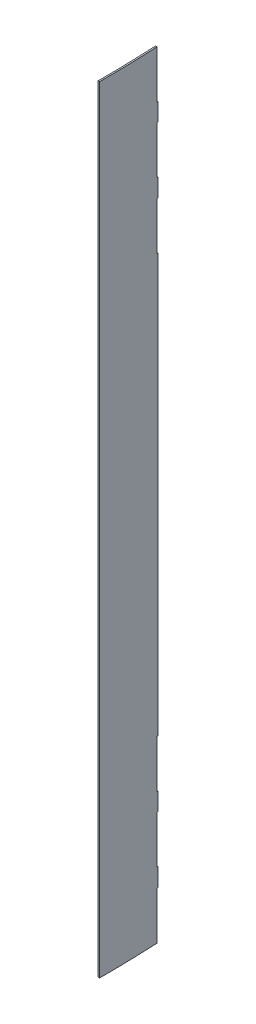
ISO-10303-21;
HEADER;
FILE_DESCRIPTION(('STEP AP214'),'2;1');
FILE_NAME('part.step','',(''),(''),'','','');
FILE_SCHEMA(('AUTOMOTIVE_DESIGN { 1 0 10303 214 1 1 1 1 }'));
ENDSEC;
DATA;
#1=APPLICATION_CONTEXT('core data for automotive mechanical design processes');
#2=APPLICATION_PROTOCOL_DEFINITION('international standard','automotive_design',2000,#1);
#3=PRODUCT_CONTEXT('',#1,'mechanical');
#4=PRODUCT('Part','Part','',(#3));
#5=PRODUCT_RELATED_PRODUCT_CATEGORY('part','',(#4));
#6=PRODUCT_DEFINITION_FORMATION('','',#4);
#7=PRODUCT_DEFINITION_CONTEXT('part definition',#1,'design');
#8=PRODUCT_DEFINITION('design','',#6,#7);
#9=PRODUCT_DEFINITION_SHAPE('','',#8);
#10=(LENGTH_UNIT() NAMED_UNIT(*) SI_UNIT(.MILLI.,.METRE.));
#11=(NAMED_UNIT(*) PLANE_ANGLE_UNIT() SI_UNIT($,.RADIAN.));
#12=(NAMED_UNIT(*) SI_UNIT($,.STERADIAN.) SOLID_ANGLE_UNIT());
#13=UNCERTAINTY_MEASURE_WITH_UNIT(LENGTH_MEASURE(1.E-05),#10,'distance_accuracy_value','');
#14=(GEOMETRIC_REPRESENTATION_CONTEXT(3) GLOBAL_UNCERTAINTY_ASSIGNED_CONTEXT((#13)) GLOBAL_UNIT_ASSIGNED_CONTEXT((#10,
#11,#12)) REPRESENTATION_CONTEXT('',''));
#15=CARTESIAN_POINT('',(0.,0.,0.));
#16=DIRECTION('',(0.,0.,1.));
#17=DIRECTION('',(1.,0.,0.));
#18=AXIS2_PLACEMENT_3D('',#15,#16,#17);
#19=CARTESIAN_POINT('',(0.,19.,0.));
#20=DIRECTION('',(0.,1.,0.));
#21=DIRECTION('',(0.,0.,1.));
#22=AXIS2_PLACEMENT_3D('',#19,#20,#21);
#23=PLANE('',#22);
#24=DIRECTION('',(-0.998690936139058,0.,0.0511508951406651));
#25=VECTOR('',#24,1.);
#26=CARTESIAN_POINT('',(195.244078015186,19.,-10.));
#27=LINE('',#26,#25);
#28=CARTESIAN_POINT('',(195.493750749221,19.,-10.0127877237851));
#29=VERTEX_POINT('',#28);
#30=CARTESIAN_POINT('',(195.244078015186,19.,-10.));
#31=VERTEX_POINT('',#30);
#32=EDGE_CURVE('E11',#29,#31,#27,.T.);
#33=ORIENTED_EDGE('',*,*,#32,.F.);
#34=CARTESIAN_POINT('',(0.,19.,0.));
#35=DIRECTION('',(0.,-1.,0.));
#36=DIRECTION('',(0.,0.,-1.));
#37=AXIS2_PLACEMENT_3D('',#34,#35,#36);
#38=CIRCLE('',#37,195.75);
#39=CARTESIAN_POINT('',(195.50137081598,19.,-9.86288543341248));
#40=VERTEX_POINT('',#39);
#41=EDGE_CURVE('E135',#29,#40,#38,.T.);
#42=ORIENTED_EDGE('',*,*,#41,.T.);
#43=DIRECTION('',(-0.998729863683168,0.,0.050385110770945));
#44=VECTOR('',#43,1.);
#45=CARTESIAN_POINT('',(195.251688350059,19.,-9.85028915571977));
#46=LINE('',#45,#44);
#47=CARTESIAN_POINT('',(195.251688350059,19.,-9.85028915571977));
#48=VERTEX_POINT('',#47);
#49=EDGE_CURVE('E49',#40,#48,#46,.T.);
#50=ORIENTED_EDGE('',*,*,#49,.T.);
#51=CARTESIAN_POINT('',(0.,19.,0.));
#52=DIRECTION('',(0.,-1.,0.));
#53=DIRECTION('',(0.,0.,1.));
#54=AXIS2_PLACEMENT_3D('',#51,#52,#53);
#55=CIRCLE('',#54,195.5);
#56=EDGE_CURVE('E138',#31,#48,#55,.T.);
#57=ORIENTED_EDGE('',*,*,#56,.F.);
#58=EDGE_LOOP('',(#33,#42,#50,#57));
#59=FACE_BOUND('',#58,.T.);
#60=ADVANCED_FACE('F39',(#59),#23,.F.);
#61=CARTESIAN_POINT('',(195.251688350059,15.,-9.85028915571974));
#62=DIRECTION('',(0.0503851107709449,0.,0.998729863683168));
#63=DIRECTION('',(0.,-1.,0.));
#64=AXIS2_PLACEMENT_3D('',#61,#62,#63);
#65=PLANE('',#64);
#66=ORIENTED_EDGE('',*,*,#49,.F.);
#67=DIRECTION('',(0.,-1.,0.));
#68=VECTOR('',#67,1.);
#69=CARTESIAN_POINT('',(195.50137081598,195.385113665422,-9.86288543341248));
#70=LINE('',#69,#68);
#71=CARTESIAN_POINT('',(195.50137081598,11.,-9.86288543341248));
#72=VERTEX_POINT('',#71);
#73=EDGE_CURVE('E151',#40,#72,#70,.T.);
#74=ORIENTED_EDGE('',*,*,#73,.T.);
#75=DIRECTION('',(-0.998729863683168,0.,0.0503851107709449));
#76=VECTOR('',#75,1.);
#77=CARTESIAN_POINT('',(195.251688350059,11.,-9.85028915571974));
#78=LINE('',#77,#76);
#79=CARTESIAN_POINT('',(195.251688350059,11.,-9.85028915571974));
#80=VERTEX_POINT('',#79);
#81=EDGE_CURVE('E220',#72,#80,#78,.T.);
#82=ORIENTED_EDGE('',*,*,#81,.T.);
#83=DIRECTION('',(0.,-1.,0.));
#84=VECTOR('',#83,1.);
#85=CARTESIAN_POINT('',(195.251688350059,11.,-9.85028915571974));
#86=LINE('',#85,#84);
#87=EDGE_CURVE('E155',#48,#80,#86,.T.);
#88=ORIENTED_EDGE('',*,*,#87,.F.);
#89=EDGE_LOOP('',(#66,#74,#82,#88));
#90=FACE_BOUND('',#89,.T.);
#91=ADVANCED_FACE('F234',(#90),#65,.F.);
#92=CARTESIAN_POINT('',(0.,11.,0.));
#93=DIRECTION('',(0.,-1.,0.));
#94=DIRECTION('',(0.,0.,-1.));
#95=AXIS2_PLACEMENT_3D('',#92,#93,#94);
#96=PLANE('',#95);
#97=ORIENTED_EDGE('',*,*,#81,.F.);
#98=CARTESIAN_POINT('',(0.,11.,0.));
#99=DIRECTION('',(0.,-1.,0.));
#100=DIRECTION('',(0.,0.,-1.));
#101=AXIS2_PLACEMENT_3D('',#98,#99,#100);
#102=CIRCLE('',#101,195.75);
#103=CARTESIAN_POINT('',(195.493750749221,11.,-10.0127877237851));
#104=VERTEX_POINT('',#103);
#105=EDGE_CURVE('E355',#72,#104,#102,.F.);
#106=ORIENTED_EDGE('',*,*,#105,.T.);
#107=DIRECTION('',(-0.998690936139058,0.,0.0511508951406648));
#108=VECTOR('',#107,1.);
#109=CARTESIAN_POINT('',(195.244078015186,11.,-9.99999999999998));
#110=LINE('',#109,#108);
#111=CARTESIAN_POINT('',(195.244078015186,11.,-9.99999999999998));
#112=VERTEX_POINT('',#111);
#113=EDGE_CURVE('E217',#104,#112,#110,.T.);
#114=ORIENTED_EDGE('',*,*,#113,.T.);
#115=CARTESIAN_POINT('',(0.,11.,0.));
#116=DIRECTION('',(0.,1.,0.));
#117=DIRECTION('',(0.,0.,-1.));
#118=AXIS2_PLACEMENT_3D('',#115,#116,#117);
#119=CIRCLE('',#118,195.5);
#120=EDGE_CURVE('E235',#80,#112,#119,.T.);
#121=ORIENTED_EDGE('',*,*,#120,.F.);
#122=EDGE_LOOP('',(#97,#106,#114,#121));
#123=FACE_BOUND('',#122,.T.);
#124=ADVANCED_FACE('F358',(#123),#96,.F.);
#125=CARTESIAN_POINT('',(195.244078015186,9.49999999999999,-9.99999999999998));
#126=DIRECTION('',(0.0511508951406648,0.,0.998690936139058));
#127=DIRECTION('',(0.,-1.,0.));
#128=AXIS2_PLACEMENT_3D('',#125,#126,#127);
#129=PLANE('',#128);
#130=ORIENTED_EDGE('',*,*,#113,.F.);
#131=DIRECTION('',(0.,-1.,0.));
#132=VECTOR('',#131,1.);
#133=CARTESIAN_POINT('',(195.493750749221,195.385113665422,-10.0127877237851));
#134=LINE('',#133,#132);
#135=CARTESIAN_POINT('',(195.493750749221,8.00000000000001,-10.0127877237851));
#136=VERTEX_POINT('',#135);
#137=EDGE_CURVE('E352',#104,#136,#134,.T.);
#138=ORIENTED_EDGE('',*,*,#137,.T.);
#139=DIRECTION('',(-0.998690936139058,0.,0.0511508951406648));
#140=VECTOR('',#139,1.);
#141=CARTESIAN_POINT('',(195.244078015186,8.00000000000001,-9.99999999999998));
#142=LINE('',#141,#140);
#143=CARTESIAN_POINT('',(195.244078015186,8.00000000000001,-9.99999999999998));
#144=VERTEX_POINT('',#143);
#145=EDGE_CURVE('E214',#136,#144,#142,.T.);
#146=ORIENTED_EDGE('',*,*,#145,.T.);
#147=DIRECTION('',(0.,-1.,0.));
#148=VECTOR('',#147,1.);
#149=CARTESIAN_POINT('',(195.244078015186,11.,-9.99999999999998));
#150=LINE('',#149,#148);
#151=EDGE_CURVE('E237',#112,#144,#150,.T.);
#152=ORIENTED_EDGE('',*,*,#151,.F.);
#153=EDGE_LOOP('',(#130,#138,#146,#152));
#154=FACE_BOUND('',#153,.T.);
#155=ADVANCED_FACE('F364',(#154),#129,.F.);
#156=CARTESIAN_POINT('',(0.,8.00000000000001,0.));
#157=DIRECTION('',(0.,1.,0.));
#158=DIRECTION('',(0.,0.,1.));
#159=AXIS2_PLACEMENT_3D('',#156,#157,#158);
#160=PLANE('',#159);
#161=ORIENTED_EDGE('',*,*,#145,.F.);
#162=CARTESIAN_POINT('',(0.,8.00000000000001,0.));
#163=DIRECTION('',(0.,-1.,0.));
#164=DIRECTION('',(0.,0.,-1.));
#165=AXIS2_PLACEMENT_3D('',#162,#163,#164);
#166=CIRCLE('',#165,195.75);
#167=CARTESIAN_POINT('',(195.50137081598,8.00000000000001,-9.86288543341248));
#168=VERTEX_POINT('',#167);
#169=EDGE_CURVE('E349',#136,#168,#166,.T.);
#170=ORIENTED_EDGE('',*,*,#169,.T.);
#171=DIRECTION('',(-0.998729863683168,0.,0.050385110770945));
#172=VECTOR('',#171,1.);
#173=CARTESIAN_POINT('',(195.251688350059,8.00000000000001,-9.85028915571977));
#174=LINE('',#173,#172);
#175=CARTESIAN_POINT('',(195.251688350059,8.00000000000001,-9.85028915571977));
#176=VERTEX_POINT('',#175);
#177=EDGE_CURVE('E211',#168,#176,#174,.T.);
#178=ORIENTED_EDGE('',*,*,#177,.T.);
#179=CARTESIAN_POINT('',(0.,8.00000000000001,0.));
#180=DIRECTION('',(0.,-1.,0.));
#181=DIRECTION('',(0.,0.,1.));
#182=AXIS2_PLACEMENT_3D('',#179,#180,#181);
#183=CIRCLE('',#182,195.5);
#184=EDGE_CURVE('E242',#144,#176,#183,.T.);
#185=ORIENTED_EDGE('',*,*,#184,.F.);
#186=EDGE_LOOP('',(#161,#170,#178,#185));
#187=FACE_BOUND('',#186,.T.);
#188=ADVANCED_FACE('F373',(#187),#160,.F.);
#189=CARTESIAN_POINT('',(195.251688350059,4.,-9.85028915571974));
#190=DIRECTION('',(0.0503851107709449,0.,0.998729863683168));
#191=DIRECTION('',(0.,-1.,0.));
#192=AXIS2_PLACEMENT_3D('',#189,#190,#191);
#193=PLANE('',#192);
#194=ORIENTED_EDGE('',*,*,#177,.F.);
#195=DIRECTION('',(0.,-1.,0.));
#196=VECTOR('',#195,1.);
#197=CARTESIAN_POINT('',(195.50137081598,195.385113665422,-9.86288543341248));
#198=LINE('',#197,#196);
#199=CARTESIAN_POINT('',(195.50137081598,0.,-9.86288543341248));
#200=VERTEX_POINT('',#199);
#201=EDGE_CURVE('E346',#168,#200,#198,.T.);
#202=ORIENTED_EDGE('',*,*,#201,.T.);
#203=DIRECTION('',(-0.998729863683168,0.,0.0503851107709449));
#204=VECTOR('',#203,1.);
#205=CARTESIAN_POINT('',(195.251688350059,0.,-9.85028915571974));
#206=LINE('',#205,#204);
#207=CARTESIAN_POINT('',(195.251688350059,0.,-9.85028915571974));
#208=VERTEX_POINT('',#207);
#209=EDGE_CURVE('E208',#200,#208,#206,.T.);
#210=ORIENTED_EDGE('',*,*,#209,.T.);
#211=DIRECTION('',(0.,-1.,0.));
#212=VECTOR('',#211,1.);
#213=CARTESIAN_POINT('',(195.251688350059,0.,-9.85028915571974));
#214=LINE('',#213,#212);
#215=EDGE_CURVE('E245',#176,#208,#214,.T.);
#216=ORIENTED_EDGE('',*,*,#215,.F.);
#217=EDGE_LOOP('',(#194,#202,#210,#216));
#218=FACE_BOUND('',#217,.T.);
#219=ADVANCED_FACE('F377',(#218),#193,.F.);
#220=CARTESIAN_POINT('',(0.,0.,0.));
#221=DIRECTION('',(0.,1.,0.));
#222=DIRECTION('',(0.,0.,1.));
#223=AXIS2_PLACEMENT_3D('',#220,#221,#222);
#224=PLANE('',#223);
#225=ORIENTED_EDGE('',*,*,#209,.F.);
#226=CARTESIAN_POINT('',(0.,0.,0.));
#227=DIRECTION('',(0.,-1.,0.));
#228=DIRECTION('',(0.,0.,-1.));
#229=AXIS2_PLACEMENT_3D('',#226,#227,#228);
#230=CIRCLE('',#229,195.75);
#231=CARTESIAN_POINT('',(195.75,0.,0.));
#232=VERTEX_POINT('',#231);
#233=EDGE_CURVE('E343',#200,#232,#230,.T.);
#234=ORIENTED_EDGE('',*,*,#233,.T.);
#235=DIRECTION('',(-1.,0.,0.));
#236=VECTOR('',#235,1.);
#237=CARTESIAN_POINT('',(195.5,0.,0.));
#238=LINE('',#237,#236);
#239=CARTESIAN_POINT('',(195.5,0.,0.));
#240=VERTEX_POINT('',#239);
#241=EDGE_CURVE('E205',#232,#240,#238,.T.);
#242=ORIENTED_EDGE('',*,*,#241,.T.);
#243=CARTESIAN_POINT('',(0.,0.,0.));
#244=DIRECTION('',(0.,-1.,0.));
#245=DIRECTION('',(0.,0.,-1.));
#246=AXIS2_PLACEMENT_3D('',#243,#244,#245);
#247=CIRCLE('',#246,195.5);
#248=EDGE_CURVE('E248',#208,#240,#247,.T.);
#249=ORIENTED_EDGE('',*,*,#248,.F.);
#250=EDGE_LOOP('',(#225,#234,#242,#249));
#251=FACE_BOUND('',#250,.T.);
#252=ADVANCED_FACE('F382',(#251),#224,.F.);
#253=CARTESIAN_POINT('',(195.5,65.,0.));
#254=DIRECTION('',(0.,0.,-1.));
#255=DIRECTION('',(0.,1.,0.));
#256=AXIS2_PLACEMENT_3D('',#253,#254,#255);
#257=PLANE('',#256);
#258=ORIENTED_EDGE('',*,*,#241,.F.);
#259=DIRECTION('',(0.,-1.,0.));
#260=VECTOR('',#259,1.);
#261=CARTESIAN_POINT('',(195.75,195.385113665422,0.));
#262=LINE('',#261,#260);
#263=CARTESIAN_POINT('',(195.75,130.,0.));
#264=VERTEX_POINT('',#263);
#265=EDGE_CURVE('E340',#232,#264,#262,.F.);
#266=ORIENTED_EDGE('',*,*,#265,.T.);
#267=DIRECTION('',(-1.,0.,0.));
#268=VECTOR('',#267,1.);
#269=CARTESIAN_POINT('',(195.5,130.,0.));
#270=LINE('',#269,#268);
#271=CARTESIAN_POINT('',(195.5,130.,0.));
#272=VERTEX_POINT('',#271);
#273=EDGE_CURVE('E202',#264,#272,#270,.T.);
#274=ORIENTED_EDGE('',*,*,#273,.T.);
#275=DIRECTION('',(0.,1.,0.));
#276=VECTOR('',#275,1.);
#277=CARTESIAN_POINT('',(195.5,0.,0.));
#278=LINE('',#277,#276);
#279=EDGE_CURVE('E251',#240,#272,#278,.T.);
#280=ORIENTED_EDGE('',*,*,#279,.F.);
#281=EDGE_LOOP('',(#258,#266,#274,#280));
#282=FACE_BOUND('',#281,.T.);
#283=ADVANCED_FACE('F391',(#282),#257,.F.);
#284=CARTESIAN_POINT('',(0.,130.,0.));
#285=DIRECTION('',(0.,-1.,0.));
#286=DIRECTION('',(0.,0.,-1.));
#287=AXIS2_PLACEMENT_3D('',#284,#285,#286);
#288=PLANE('',#287);
#289=ORIENTED_EDGE('',*,*,#273,.F.);
#290=CARTESIAN_POINT('',(0.,130.,0.));
#291=DIRECTION('',(0.,-1.,0.));
#292=DIRECTION('',(0.,0.,-1.));
#293=AXIS2_PLACEMENT_3D('',#290,#291,#292);
#294=CIRCLE('',#293,195.75);
#295=CARTESIAN_POINT('',(195.50137081598,130.,-9.86288543341248));
#296=VERTEX_POINT('',#295);
#297=EDGE_CURVE('E337',#264,#296,#294,.F.);
#298=ORIENTED_EDGE('',*,*,#297,.T.);
#299=DIRECTION('',(-0.998729863683168,0.,0.0503851107709448));
#300=VECTOR('',#299,1.);
#301=CARTESIAN_POINT('',(195.251688350059,130.,-9.85028915571973));
#302=LINE('',#301,#300);
#303=CARTESIAN_POINT('',(195.251688350059,130.,-9.85028915571973));
#304=VERTEX_POINT('',#303);
#305=EDGE_CURVE('E199',#296,#304,#302,.T.);
#306=ORIENTED_EDGE('',*,*,#305,.T.);
#307=CARTESIAN_POINT('',(0.,130.,0.));
#308=DIRECTION('',(0.,1.,0.));
#309=DIRECTION('',(0.,0.,1.));
#310=AXIS2_PLACEMENT_3D('',#307,#308,#309);
#311=CIRCLE('',#310,195.5);
#312=EDGE_CURVE('E254',#272,#304,#311,.T.);
#313=ORIENTED_EDGE('',*,*,#312,.F.);
#314=EDGE_LOOP('',(#289,#298,#306,#313));
#315=FACE_BOUND('',#314,.T.);
#316=ADVANCED_FACE('F395',(#315),#288,.F.);
#317=CARTESIAN_POINT('',(195.251688350059,126.,-9.85028915571974));
#318=DIRECTION('',(0.0503851107709449,0.,0.998729863683168));
#319=DIRECTION('',(0.,-1.,0.));
#320=AXIS2_PLACEMENT_3D('',#317,#318,#319);
#321=PLANE('',#320);
#322=ORIENTED_EDGE('',*,*,#305,.F.);
#323=DIRECTION('',(0.,-1.,0.));
#324=VECTOR('',#323,1.);
#325=CARTESIAN_POINT('',(195.50137081598,195.385113665422,-9.86288543341248));
#326=LINE('',#325,#324);
#327=CARTESIAN_POINT('',(195.50137081598,122.,-9.86288543341248));
#328=VERTEX_POINT('',#327);
#329=EDGE_CURVE('E334',#296,#328,#326,.T.);
#330=ORIENTED_EDGE('',*,*,#329,.T.);
#331=DIRECTION('',(-0.998729863683168,0.,0.0503851107709449));
#332=VECTOR('',#331,1.);
#333=CARTESIAN_POINT('',(195.251688350059,122.,-9.85028915571974));
#334=LINE('',#333,#332);
#335=CARTESIAN_POINT('',(195.251688350059,122.,-9.85028915571974));
#336=VERTEX_POINT('',#335);
#337=EDGE_CURVE('E196',#328,#336,#334,.T.);
#338=ORIENTED_EDGE('',*,*,#337,.T.);
#339=DIRECTION('',(0.,-1.,0.));
#340=VECTOR('',#339,1.);
#341=CARTESIAN_POINT('',(195.251688350059,122.,-9.85028915571974));
#342=LINE('',#341,#340);
#343=EDGE_CURVE('E257',#304,#336,#342,.T.);
#344=ORIENTED_EDGE('',*,*,#343,.F.);
#345=EDGE_LOOP('',(#322,#330,#338,#344));
#346=FACE_BOUND('',#345,.T.);
#347=ADVANCED_FACE('F400',(#346),#321,.F.);
#348=CARTESIAN_POINT('',(0.,122.,0.));
#349=DIRECTION('',(0.,-1.,0.));
#350=DIRECTION('',(0.,0.,-1.));
#351=AXIS2_PLACEMENT_3D('',#348,#349,#350);
#352=PLANE('',#351);
#353=ORIENTED_EDGE('',*,*,#337,.F.);
#354=CARTESIAN_POINT('',(0.,122.,0.));
#355=DIRECTION('',(0.,-1.,0.));
#356=DIRECTION('',(0.,0.,-1.));
#357=AXIS2_PLACEMENT_3D('',#354,#355,#356);
#358=CIRCLE('',#357,195.75);
#359=CARTESIAN_POINT('',(195.493750749221,122.,-10.0127877237851));
#360=VERTEX_POINT('',#359);
#361=EDGE_CURVE('E331',#328,#360,#358,.F.);
#362=ORIENTED_EDGE('',*,*,#361,.T.);
#363=DIRECTION('',(-0.998690936139058,0.,0.0511508951406648));
#364=VECTOR('',#363,1.);
#365=CARTESIAN_POINT('',(195.244078015186,122.,-9.99999999999998));
#366=LINE('',#365,#364);
#367=CARTESIAN_POINT('',(195.244078015186,122.,-9.99999999999998));
#368=VERTEX_POINT('',#367);
#369=EDGE_CURVE('E193',#360,#368,#366,.T.);
#370=ORIENTED_EDGE('',*,*,#369,.T.);
#371=CARTESIAN_POINT('',(0.,122.,0.));
#372=DIRECTION('',(0.,1.,0.));
#373=DIRECTION('',(0.,0.,-1.));
#374=AXIS2_PLACEMENT_3D('',#371,#372,#373);
#375=CIRCLE('',#374,195.5);
#376=EDGE_CURVE('E260',#336,#368,#375,.T.);
#377=ORIENTED_EDGE('',*,*,#376,.F.);
#378=EDGE_LOOP('',(#353,#362,#370,#377));
#379=FACE_BOUND('',#378,.T.);
#380=ADVANCED_FACE('F409',(#379),#352,.F.);
#381=CARTESIAN_POINT('',(195.244078015186,120.5,-9.99999999999998));
#382=DIRECTION('',(0.0511508951406648,0.,0.998690936139058));
#383=DIRECTION('',(0.,-1.,0.));
#384=AXIS2_PLACEMENT_3D('',#381,#382,#383);
#385=PLANE('',#384);
#386=ORIENTED_EDGE('',*,*,#369,.F.);
#387=DIRECTION('',(0.,-1.,0.));
#388=VECTOR('',#387,1.);
#389=CARTESIAN_POINT('',(195.493750749221,195.385113665422,-10.0127877237851));
#390=LINE('',#389,#388);
#391=CARTESIAN_POINT('',(195.493750749221,119.,-10.0127877237851));
#392=VERTEX_POINT('',#391);
#393=EDGE_CURVE('E328',#360,#392,#390,.T.);
#394=ORIENTED_EDGE('',*,*,#393,.T.);
#395=DIRECTION('',(-0.998690936139058,0.,0.0511508951406648));
#396=VECTOR('',#395,1.);
#397=CARTESIAN_POINT('',(195.244078015186,119.,-9.99999999999998));
#398=LINE('',#397,#396);
#399=CARTESIAN_POINT('',(195.244078015186,119.,-9.99999999999998));
#400=VERTEX_POINT('',#399);
#401=EDGE_CURVE('E190',#392,#400,#398,.T.);
#402=ORIENTED_EDGE('',*,*,#401,.T.);
#403=DIRECTION('',(0.,-1.,0.));
#404=VECTOR('',#403,1.);
#405=CARTESIAN_POINT('',(195.244078015186,122.,-9.99999999999998));
#406=LINE('',#405,#404);
#407=EDGE_CURVE('E263',#368,#400,#406,.T.);
#408=ORIENTED_EDGE('',*,*,#407,.F.);
#409=EDGE_LOOP('',(#386,#394,#402,#408));
#410=FACE_BOUND('',#409,.T.);
#411=ADVANCED_FACE('F413',(#410),#385,.F.);
#412=CARTESIAN_POINT('',(0.,119.,0.));
#413=DIRECTION('',(0.,1.,0.));
#414=DIRECTION('',(0.,0.,1.));
#415=AXIS2_PLACEMENT_3D('',#412,#413,#414);
#416=PLANE('',#415);
#417=ORIENTED_EDGE('',*,*,#401,.F.);
#418=CARTESIAN_POINT('',(0.,119.,0.));
#419=DIRECTION('',(0.,-1.,0.));
#420=DIRECTION('',(0.,0.,-1.));
#421=AXIS2_PLACEMENT_3D('',#418,#419,#420);
#422=CIRCLE('',#421,195.75);
#423=CARTESIAN_POINT('',(195.50137081598,119.,-9.86288543341248));
#424=VERTEX_POINT('',#423);
#425=EDGE_CURVE('E325',#392,#424,#422,.T.);
#426=ORIENTED_EDGE('',*,*,#425,.T.);
#427=DIRECTION('',(-0.998729863683168,0.,0.050385110770945));
#428=VECTOR('',#427,1.);
#429=CARTESIAN_POINT('',(195.251688350059,119.,-9.85028915571977));
#430=LINE('',#429,#428);
#431=CARTESIAN_POINT('',(195.251688350059,119.,-9.85028915571977));
#432=VERTEX_POINT('',#431);
#433=EDGE_CURVE('E187',#424,#432,#430,.T.);
#434=ORIENTED_EDGE('',*,*,#433,.T.);
#435=CARTESIAN_POINT('',(0.,119.,0.));
#436=DIRECTION('',(0.,-1.,0.));
#437=DIRECTION('',(0.,0.,1.));
#438=AXIS2_PLACEMENT_3D('',#435,#436,#437);
#439=CIRCLE('',#438,195.5);
#440=EDGE_CURVE('E266',#400,#432,#439,.T.);
#441=ORIENTED_EDGE('',*,*,#440,.F.);
#442=EDGE_LOOP('',(#417,#426,#434,#441));
#443=FACE_BOUND('',#442,.T.);
#444=ADVANCED_FACE('F418',(#443),#416,.F.);
#445=CARTESIAN_POINT('',(195.251688350059,115.,-9.85028915571974));
#446=DIRECTION('',(0.0503851107709449,0.,0.998729863683168));
#447=DIRECTION('',(0.,-1.,0.));
#448=AXIS2_PLACEMENT_3D('',#445,#446,#447);
#449=PLANE('',#448);
#450=ORIENTED_EDGE('',*,*,#433,.F.);
#451=DIRECTION('',(0.,-1.,0.));
#452=VECTOR('',#451,1.);
#453=CARTESIAN_POINT('',(195.50137081598,195.385113665422,-9.86288543341248));
#454=LINE('',#453,#452);
#455=CARTESIAN_POINT('',(195.50137081598,111.,-9.86288543341248));
#456=VERTEX_POINT('',#455);
#457=EDGE_CURVE('E322',#424,#456,#454,.T.);
#458=ORIENTED_EDGE('',*,*,#457,.T.);
#459=DIRECTION('',(-0.998729863683168,0.,0.0503851107709449));
#460=VECTOR('',#459,1.);
#461=CARTESIAN_POINT('',(195.251688350059,111.,-9.85028915571974));
#462=LINE('',#461,#460);
#463=CARTESIAN_POINT('',(195.251688350059,111.,-9.85028915571974));
#464=VERTEX_POINT('',#463);
#465=EDGE_CURVE('E184',#456,#464,#462,.T.);
#466=ORIENTED_EDGE('',*,*,#465,.T.);
#467=DIRECTION('',(0.,-1.,0.));
#468=VECTOR('',#467,1.);
#469=CARTESIAN_POINT('',(195.251688350059,111.,-9.85028915571974));
#470=LINE('',#469,#468);
#471=EDGE_CURVE('E269',#432,#464,#470,.T.);
#472=ORIENTED_EDGE('',*,*,#471,.F.);
#473=EDGE_LOOP('',(#450,#458,#466,#472));
#474=FACE_BOUND('',#473,.T.);
#475=ADVANCED_FACE('F427',(#474),#449,.F.);
#476=CARTESIAN_POINT('',(0.,111.,0.));
#477=DIRECTION('',(0.,-1.,0.));
#478=DIRECTION('',(0.,0.,-1.));
#479=AXIS2_PLACEMENT_3D('',#476,#477,#478);
#480=PLANE('',#479);
#481=ORIENTED_EDGE('',*,*,#465,.F.);
#482=CARTESIAN_POINT('',(0.,111.,0.));
#483=DIRECTION('',(0.,-1.,0.));
#484=DIRECTION('',(0.,0.,-1.));
#485=AXIS2_PLACEMENT_3D('',#482,#483,#484);
#486=CIRCLE('',#485,195.75);
#487=CARTESIAN_POINT('',(195.493750749221,111.,-10.0127877237851));
#488=VERTEX_POINT('',#487);
#489=EDGE_CURVE('E319',#456,#488,#486,.F.);
#490=ORIENTED_EDGE('',*,*,#489,.T.);
#491=DIRECTION('',(-0.998690936139058,0.,0.0511508951406648));
#492=VECTOR('',#491,1.);
#493=CARTESIAN_POINT('',(195.244078015186,111.,-9.99999999999998));
#494=LINE('',#493,#492);
#495=CARTESIAN_POINT('',(195.244078015186,111.,-9.99999999999998));
#496=VERTEX_POINT('',#495);
#497=EDGE_CURVE('E181',#488,#496,#494,.T.);
#498=ORIENTED_EDGE('',*,*,#497,.T.);
#499=CARTESIAN_POINT('',(0.,111.,0.));
#500=DIRECTION('',(0.,1.,0.));
#501=DIRECTION('',(0.,0.,-1.));
#502=AXIS2_PLACEMENT_3D('',#499,#500,#501);
#503=CIRCLE('',#502,195.5);
#504=EDGE_CURVE('E272',#464,#496,#503,.T.);
#505=ORIENTED_EDGE('',*,*,#504,.F.);
#506=EDGE_LOOP('',(#481,#490,#498,#505));
#507=FACE_BOUND('',#506,.T.);
#508=ADVANCED_FACE('F431',(#507),#480,.F.);
#509=CARTESIAN_POINT('',(195.244078015186,109.5,-9.99999999999998));
#510=DIRECTION('',(0.0511508951406648,0.,0.998690936139058));
#511=DIRECTION('',(0.,-1.,0.));
#512=AXIS2_PLACEMENT_3D('',#509,#510,#511);
#513=PLANE('',#512);
#514=ORIENTED_EDGE('',*,*,#497,.F.);
#515=DIRECTION('',(0.,-1.,0.));
#516=VECTOR('',#515,1.);
#517=CARTESIAN_POINT('',(195.493750749221,195.385113665422,-10.0127877237851));
#518=LINE('',#517,#516);
#519=CARTESIAN_POINT('',(195.493750749221,108.,-10.0127877237851));
#520=VERTEX_POINT('',#519);
#521=EDGE_CURVE('E316',#488,#520,#518,.T.);
#522=ORIENTED_EDGE('',*,*,#521,.T.);
#523=DIRECTION('',(-0.998690936139058,0.,0.0511508951406648));
#524=VECTOR('',#523,1.);
#525=CARTESIAN_POINT('',(195.244078015186,108.,-9.99999999999998));
#526=LINE('',#525,#524);
#527=CARTESIAN_POINT('',(195.244078015186,108.,-9.99999999999998));
#528=VERTEX_POINT('',#527);
#529=EDGE_CURVE('E178',#520,#528,#526,.T.);
#530=ORIENTED_EDGE('',*,*,#529,.T.);
#531=DIRECTION('',(0.,-1.,0.));
#532=VECTOR('',#531,1.);
#533=CARTESIAN_POINT('',(195.244078015186,111.,-9.99999999999998));
#534=LINE('',#533,#532);
#535=EDGE_CURVE('E275',#496,#528,#534,.T.);
#536=ORIENTED_EDGE('',*,*,#535,.F.);
#537=EDGE_LOOP('',(#514,#522,#530,#536));
#538=FACE_BOUND('',#537,.T.);
#539=ADVANCED_FACE('F436',(#538),#513,.F.);
#540=CARTESIAN_POINT('',(0.,108.,0.));
#541=DIRECTION('',(0.,1.,0.));
#542=DIRECTION('',(0.,0.,1.));
#543=AXIS2_PLACEMENT_3D('',#540,#541,#542);
#544=PLANE('',#543);
#545=ORIENTED_EDGE('',*,*,#529,.F.);
#546=CARTESIAN_POINT('',(0.,108.,0.));
#547=DIRECTION('',(0.,-1.,0.));
#548=DIRECTION('',(0.,0.,-1.));
#549=AXIS2_PLACEMENT_3D('',#546,#547,#548);
#550=CIRCLE('',#549,195.75);
#551=CARTESIAN_POINT('',(195.50137081598,108.,-9.86288543341248));
#552=VERTEX_POINT('',#551);
#553=EDGE_CURVE('E313',#520,#552,#550,.T.);
#554=ORIENTED_EDGE('',*,*,#553,.T.);
#555=DIRECTION('',(-0.998729863683168,0.,0.050385110770945));
#556=VECTOR('',#555,1.);
#557=CARTESIAN_POINT('',(195.251688350059,108.,-9.85028915571977));
#558=LINE('',#557,#556);
#559=CARTESIAN_POINT('',(195.251688350059,108.,-9.85028915571977));
#560=VERTEX_POINT('',#559);
#561=EDGE_CURVE('E175',#552,#560,#558,.T.);
#562=ORIENTED_EDGE('',*,*,#561,.T.);
#563=CARTESIAN_POINT('',(0.,108.,0.));
#564=DIRECTION('',(0.,-1.,0.));
#565=DIRECTION('',(0.,0.,1.));
#566=AXIS2_PLACEMENT_3D('',#563,#564,#565);
#567=CIRCLE('',#566,195.5);
#568=EDGE_CURVE('E278',#528,#560,#567,.T.);
#569=ORIENTED_EDGE('',*,*,#568,.F.);
#570=EDGE_LOOP('',(#545,#554,#562,#569));
#571=FACE_BOUND('',#570,.T.);
#572=ADVANCED_FACE('F445',(#571),#544,.F.);
#573=CARTESIAN_POINT('',(195.251688350059,104.,-9.85028915571974));
#574=DIRECTION('',(0.0503851107709449,0.,0.998729863683168));
#575=DIRECTION('',(0.,-1.,0.));
#576=AXIS2_PLACEMENT_3D('',#573,#574,#575);
#577=PLANE('',#576);
#578=ORIENTED_EDGE('',*,*,#561,.F.);
#579=DIRECTION('',(0.,-1.,0.));
#580=VECTOR('',#579,1.);
#581=CARTESIAN_POINT('',(195.50137081598,195.385113665422,-9.86288543341248));
#582=LINE('',#581,#580);
#583=CARTESIAN_POINT('',(195.50137081598,100.,-9.86288543341248));
#584=VERTEX_POINT('',#583);
#585=EDGE_CURVE('E310',#552,#584,#582,.T.);
#586=ORIENTED_EDGE('',*,*,#585,.T.);
#587=DIRECTION('',(-0.998729863683168,0.,0.0503851107709449));
#588=VECTOR('',#587,1.);
#589=CARTESIAN_POINT('',(195.251688350059,100.,-9.85028915571974));
#590=LINE('',#589,#588);
#591=CARTESIAN_POINT('',(195.251688350059,100.,-9.85028915571974));
#592=VERTEX_POINT('',#591);
#593=EDGE_CURVE('E172',#584,#592,#590,.T.);
#594=ORIENTED_EDGE('',*,*,#593,.T.);
#595=DIRECTION('',(0.,-1.,0.));
#596=VECTOR('',#595,1.);
#597=CARTESIAN_POINT('',(195.251688350059,100.,-9.85028915571974));
#598=LINE('',#597,#596);
#599=EDGE_CURVE('E281',#560,#592,#598,.T.);
#600=ORIENTED_EDGE('',*,*,#599,.F.);
#601=EDGE_LOOP('',(#578,#586,#594,#600));
#602=FACE_BOUND('',#601,.T.);
#603=ADVANCED_FACE('F449',(#602),#577,.F.);
#604=CARTESIAN_POINT('',(0.,100.,0.));
#605=DIRECTION('',(0.,-1.,0.));
#606=DIRECTION('',(0.,0.,-1.));
#607=AXIS2_PLACEMENT_3D('',#604,#605,#606);
#608=PLANE('',#607);
#609=ORIENTED_EDGE('',*,*,#593,.F.);
#610=CARTESIAN_POINT('',(0.,100.,0.));
#611=DIRECTION('',(0.,-1.,0.));
#612=DIRECTION('',(0.,0.,-1.));
#613=AXIS2_PLACEMENT_3D('',#610,#611,#612);
#614=CIRCLE('',#613,195.75);
#615=CARTESIAN_POINT('',(195.493750749221,100.,-10.0127877237851));
#616=VERTEX_POINT('',#615);
#617=EDGE_CURVE('E307',#584,#616,#614,.F.);
#618=ORIENTED_EDGE('',*,*,#617,.T.);
#619=DIRECTION('',(-0.998690936139058,0.,0.0511508951406648));
#620=VECTOR('',#619,1.);
#621=CARTESIAN_POINT('',(195.244078015186,100.,-9.99999999999998));
#622=LINE('',#621,#620);
#623=CARTESIAN_POINT('',(195.244078015186,100.,-9.99999999999998));
#624=VERTEX_POINT('',#623);
#625=EDGE_CURVE('E169',#616,#624,#622,.T.);
#626=ORIENTED_EDGE('',*,*,#625,.T.);
#627=CARTESIAN_POINT('',(0.,100.,0.));
#628=DIRECTION('',(0.,1.,0.));
#629=DIRECTION('',(0.,0.,-1.));
#630=AXIS2_PLACEMENT_3D('',#627,#628,#629);
#631=CIRCLE('',#630,195.5);
#632=EDGE_CURVE('E284',#592,#624,#631,.T.);
#633=ORIENTED_EDGE('',*,*,#632,.F.);
#634=EDGE_LOOP('',(#609,#618,#626,#633));
#635=FACE_BOUND('',#634,.T.);
#636=ADVANCED_FACE('F454',(#635),#608,.F.);
#637=CARTESIAN_POINT('',(195.244078015186,65.,-9.99999999999998));
#638=DIRECTION('',(0.0511508951406648,0.,0.998690936139058));
#639=DIRECTION('',(0.,-1.,0.));
#640=AXIS2_PLACEMENT_3D('',#637,#638,#639);
#641=PLANE('',#640);
#642=ORIENTED_EDGE('',*,*,#625,.F.);
#643=DIRECTION('',(0.,-1.,0.));
#644=VECTOR('',#643,1.);
#645=CARTESIAN_POINT('',(195.493750749221,195.385113665422,-10.0127877237851));
#646=LINE('',#645,#644);
#647=CARTESIAN_POINT('',(195.493750749221,30.,-10.0127877237851));
#648=VERTEX_POINT('',#647);
#649=EDGE_CURVE('E304',#616,#648,#646,.T.);
#650=ORIENTED_EDGE('',*,*,#649,.T.);
#651=DIRECTION('',(-0.998690936139058,0.,0.0511508951406648));
#652=VECTOR('',#651,1.);
#653=CARTESIAN_POINT('',(195.244078015186,30.,-9.99999999999998));
#654=LINE('',#653,#652);
#655=CARTESIAN_POINT('',(195.244078015186,30.,-9.99999999999998));
#656=VERTEX_POINT('',#655);
#657=EDGE_CURVE('E166',#648,#656,#654,.T.);
#658=ORIENTED_EDGE('',*,*,#657,.T.);
#659=DIRECTION('',(0.,-1.,0.));
#660=VECTOR('',#659,1.);
#661=CARTESIAN_POINT('',(195.244078015186,100.,-9.99999999999998));
#662=LINE('',#661,#660);
#663=EDGE_CURVE('E287',#624,#656,#662,.T.);
#664=ORIENTED_EDGE('',*,*,#663,.F.);
#665=EDGE_LOOP('',(#642,#650,#658,#664));
#666=FACE_BOUND('',#665,.T.);
#667=ADVANCED_FACE('F463',(#666),#641,.F.);
#668=CARTESIAN_POINT('',(0.,30.,0.));
#669=DIRECTION('',(0.,1.,0.));
#670=DIRECTION('',(0.,0.,1.));
#671=AXIS2_PLACEMENT_3D('',#668,#669,#670);
#672=PLANE('',#671);
#673=ORIENTED_EDGE('',*,*,#657,.F.);
#674=CARTESIAN_POINT('',(0.,30.,0.));
#675=DIRECTION('',(0.,-1.,0.));
#676=DIRECTION('',(0.,0.,-1.));
#677=AXIS2_PLACEMENT_3D('',#674,#675,#676);
#678=CIRCLE('',#677,195.75);
#679=CARTESIAN_POINT('',(195.50137081598,30.,-9.86288543341248));
#680=VERTEX_POINT('',#679);
#681=EDGE_CURVE('E301',#648,#680,#678,.T.);
#682=ORIENTED_EDGE('',*,*,#681,.T.);
#683=DIRECTION('',(-0.998729863683168,0.,0.050385110770945));
#684=VECTOR('',#683,1.);
#685=CARTESIAN_POINT('',(195.251688350059,30.,-9.85028915571977));
#686=LINE('',#685,#684);
#687=CARTESIAN_POINT('',(195.251688350059,30.,-9.85028915571977));
#688=VERTEX_POINT('',#687);
#689=EDGE_CURVE('E163',#680,#688,#686,.T.);
#690=ORIENTED_EDGE('',*,*,#689,.T.);
#691=CARTESIAN_POINT('',(0.,30.,0.));
#692=DIRECTION('',(0.,-1.,0.));
#693=DIRECTION('',(0.,0.,1.));
#694=AXIS2_PLACEMENT_3D('',#691,#692,#693);
#695=CIRCLE('',#694,195.5);
#696=EDGE_CURVE('E290',#656,#688,#695,.T.);
#697=ORIENTED_EDGE('',*,*,#696,.F.);
#698=EDGE_LOOP('',(#673,#682,#690,#697));
#699=FACE_BOUND('',#698,.T.);
#700=ADVANCED_FACE('F466',(#699),#672,.F.);
#701=CARTESIAN_POINT('',(195.251688350059,26.,-9.85028915571974));
#702=DIRECTION('',(0.0503851107709449,0.,0.998729863683168));
#703=DIRECTION('',(0.,-1.,0.));
#704=AXIS2_PLACEMENT_3D('',#701,#702,#703);
#705=PLANE('',#704);
#706=ORIENTED_EDGE('',*,*,#689,.F.);
#707=DIRECTION('',(0.,-1.,0.));
#708=VECTOR('',#707,1.);
#709=CARTESIAN_POINT('',(195.50137081598,195.385113665422,-9.86288543341248));
#710=LINE('',#709,#708);
#711=CARTESIAN_POINT('',(195.50137081598,22.,-9.86288543341248));
#712=VERTEX_POINT('',#711);
#713=EDGE_CURVE('E157',#680,#712,#710,.T.);
#714=ORIENTED_EDGE('',*,*,#713,.T.);
#715=DIRECTION('',(-0.998729863683168,0.,0.0503851107709449));
#716=VECTOR('',#715,1.);
#717=CARTESIAN_POINT('',(195.251688350059,22.,-9.85028915571974));
#718=LINE('',#717,#716);
#719=CARTESIAN_POINT('',(195.251688350059,22.,-9.85028915571974));
#720=VERTEX_POINT('',#719);
#721=EDGE_CURVE('E161',#712,#720,#718,.T.);
#722=ORIENTED_EDGE('',*,*,#721,.T.);
#723=DIRECTION('',(0.,-1.,0.));
#724=VECTOR('',#723,1.);
#725=CARTESIAN_POINT('',(195.251688350059,22.,-9.85028915571974));
#726=LINE('',#725,#724);
#727=EDGE_CURVE('E293',#688,#720,#726,.T.);
#728=ORIENTED_EDGE('',*,*,#727,.F.);
#729=EDGE_LOOP('',(#706,#714,#722,#728));
#730=FACE_BOUND('',#729,.T.);
#731=ADVANCED_FACE('F469',(#730),#705,.F.);
#732=CARTESIAN_POINT('',(0.,22.,0.));
#733=DIRECTION('',(0.,-1.,0.));
#734=DIRECTION('',(0.,0.,-1.));
#735=AXIS2_PLACEMENT_3D('',#732,#733,#734);
#736=PLANE('',#735);
#737=ORIENTED_EDGE('',*,*,#721,.F.);
#738=CARTESIAN_POINT('',(0.,22.,0.));
#739=DIRECTION('',(0.,-1.,0.));
#740=DIRECTION('',(0.,0.,-1.));
#741=AXIS2_PLACEMENT_3D('',#738,#739,#740);
#742=CIRCLE('',#741,195.75);
#743=CARTESIAN_POINT('',(195.493750749221,22.,-10.0127877237851));
#744=VERTEX_POINT('',#743);
#745=EDGE_CURVE('E153',#712,#744,#742,.F.);
#746=ORIENTED_EDGE('',*,*,#745,.T.);
#747=DIRECTION('',(-0.998690936139058,0.,0.0511508951406648));
#748=VECTOR('',#747,1.);
#749=CARTESIAN_POINT('',(195.244078015186,22.,-9.99999999999998));
#750=LINE('',#749,#748);
#751=CARTESIAN_POINT('',(195.244078015186,22.,-9.99999999999998));
#752=VERTEX_POINT('',#751);
#753=EDGE_CURVE('E43',#744,#752,#750,.T.);
#754=ORIENTED_EDGE('',*,*,#753,.T.);
#755=CARTESIAN_POINT('',(0.,22.,0.));
#756=DIRECTION('',(0.,1.,0.));
#757=DIRECTION('',(0.,0.,-1.));
#758=AXIS2_PLACEMENT_3D('',#755,#756,#757);
#759=CIRCLE('',#758,195.5);
#760=EDGE_CURVE('E296',#720,#752,#759,.T.);
#761=ORIENTED_EDGE('',*,*,#760,.F.);
#762=EDGE_LOOP('',(#737,#746,#754,#761));
#763=FACE_BOUND('',#762,.T.);
#764=ADVANCED_FACE('F471',(#763),#736,.F.);
#765=CARTESIAN_POINT('',(195.244078015186,20.5,-9.99999999999998));
#766=DIRECTION('',(0.0511508951406648,0.,0.998690936139058));
#767=DIRECTION('',(0.,-1.,0.));
#768=AXIS2_PLACEMENT_3D('',#765,#766,#767);
#769=PLANE('',#768);
#770=DIRECTION('',(0.,-1.,0.));
#771=VECTOR('',#770,1.);
#772=CARTESIAN_POINT('',(195.493750749221,195.385113665422,-10.0127877237851));
#773=LINE('',#772,#771);
#774=EDGE_CURVE('E148',#744,#29,#773,.T.);
#775=ORIENTED_EDGE('',*,*,#774,.T.);
#776=ORIENTED_EDGE('',*,*,#32,.T.);
#777=DIRECTION('',(0.,-1.,0.));
#778=VECTOR('',#777,1.);
#779=CARTESIAN_POINT('',(195.244078015186,22.,-9.99999999999998));
#780=LINE('',#779,#778);
#781=EDGE_CURVE('E233',#752,#31,#780,.T.);
#782=ORIENTED_EDGE('',*,*,#781,.F.);
#783=ORIENTED_EDGE('',*,*,#753,.F.);
#784=EDGE_LOOP('',(#775,#776,#782,#783));
#785=FACE_BOUND('',#784,.T.);
#786=ADVANCED_FACE('F41',(#785),#769,.F.);
#787=CARTESIAN_POINT('',(0.,195.385113665422,0.));
#788=DIRECTION('',(0.,-1.,0.));
#789=DIRECTION('',(0.,0.,-1.));
#790=AXIS2_PLACEMENT_3D('',#787,#788,#789);
#791=CYLINDRICAL_SURFACE('',#790,195.5);
#792=ORIENTED_EDGE('',*,*,#760,.T.);
#793=ORIENTED_EDGE('',*,*,#781,.T.);
#794=ORIENTED_EDGE('',*,*,#56,.T.);
#795=ORIENTED_EDGE('',*,*,#87,.T.);
#796=ORIENTED_EDGE('',*,*,#120,.T.);
#797=ORIENTED_EDGE('',*,*,#151,.T.);
#798=ORIENTED_EDGE('',*,*,#184,.T.);
#799=ORIENTED_EDGE('',*,*,#215,.T.);
#800=ORIENTED_EDGE('',*,*,#248,.T.);
#801=ORIENTED_EDGE('',*,*,#279,.T.);
#802=ORIENTED_EDGE('',*,*,#312,.T.);
#803=ORIENTED_EDGE('',*,*,#343,.T.);
#804=ORIENTED_EDGE('',*,*,#376,.T.);
#805=ORIENTED_EDGE('',*,*,#407,.T.);
#806=ORIENTED_EDGE('',*,*,#440,.T.);
#807=ORIENTED_EDGE('',*,*,#471,.T.);
#808=ORIENTED_EDGE('',*,*,#504,.T.);
#809=ORIENTED_EDGE('',*,*,#535,.T.);
#810=ORIENTED_EDGE('',*,*,#568,.T.);
#811=ORIENTED_EDGE('',*,*,#599,.T.);
#812=ORIENTED_EDGE('',*,*,#632,.T.);
#813=ORIENTED_EDGE('',*,*,#663,.T.);
#814=ORIENTED_EDGE('',*,*,#696,.T.);
#815=ORIENTED_EDGE('',*,*,#727,.T.);
#816=EDGE_LOOP('',(#792,#793,#794,#795,#796,#797,#798,#799,#800,#801,#802,#803,#804,#805,#806,
#807,#808,#809,#810,#811,#812,#813,#814,#815));
#817=FACE_BOUND('',#816,.T.);
#818=ADVANCED_FACE('F230',(#817),#791,.F.);
#819=CARTESIAN_POINT('',(0.,195.385113665422,0.));
#820=DIRECTION('',(0.,-1.,0.));
#821=DIRECTION('',(0.,0.,-1.));
#822=AXIS2_PLACEMENT_3D('',#819,#820,#821);
#823=CYLINDRICAL_SURFACE('',#822,195.75);
#824=ORIENTED_EDGE('',*,*,#745,.F.);
#825=ORIENTED_EDGE('',*,*,#713,.F.);
#826=ORIENTED_EDGE('',*,*,#681,.F.);
#827=ORIENTED_EDGE('',*,*,#649,.F.);
#828=ORIENTED_EDGE('',*,*,#617,.F.);
#829=ORIENTED_EDGE('',*,*,#585,.F.);
#830=ORIENTED_EDGE('',*,*,#553,.F.);
#831=ORIENTED_EDGE('',*,*,#521,.F.);
#832=ORIENTED_EDGE('',*,*,#489,.F.);
#833=ORIENTED_EDGE('',*,*,#457,.F.);
#834=ORIENTED_EDGE('',*,*,#425,.F.);
#835=ORIENTED_EDGE('',*,*,#393,.F.);
#836=ORIENTED_EDGE('',*,*,#361,.F.);
#837=ORIENTED_EDGE('',*,*,#329,.F.);
#838=ORIENTED_EDGE('',*,*,#297,.F.);
#839=ORIENTED_EDGE('',*,*,#265,.F.);
#840=ORIENTED_EDGE('',*,*,#233,.F.);
#841=ORIENTED_EDGE('',*,*,#201,.F.);
#842=ORIENTED_EDGE('',*,*,#169,.F.);
#843=ORIENTED_EDGE('',*,*,#137,.F.);
#844=ORIENTED_EDGE('',*,*,#105,.F.);
#845=ORIENTED_EDGE('',*,*,#73,.F.);
#846=ORIENTED_EDGE('',*,*,#41,.F.);
#847=ORIENTED_EDGE('',*,*,#774,.F.);
#848=EDGE_LOOP('',(#824,#825,#826,#827,#828,#829,#830,#831,#832,#833,#834,#835,#836,#837,#838,
#839,#840,#841,#842,#843,#844,#845,#846,#847));
#849=FACE_BOUND('',#848,.T.);
#850=ADVANCED_FACE('F147',(#849),#823,.T.);
#851=CLOSED_SHELL('',(#60,#91,#124,#155,#188,#219,#252,#283,#316,#347,#380,#411,#444,#475,#508,
#539,#572,#603,#636,#667,#700,#731,#764,#786,#818,#850));
#852=MANIFOLD_SOLID_BREP('B2',#851);
#853=ADVANCED_BREP_SHAPE_REPRESENTATION('',(#18,#852),#14);
#854=SHAPE_DEFINITION_REPRESENTATION(#9,#853);
ENDSEC;
END-ISO-10303-21;
